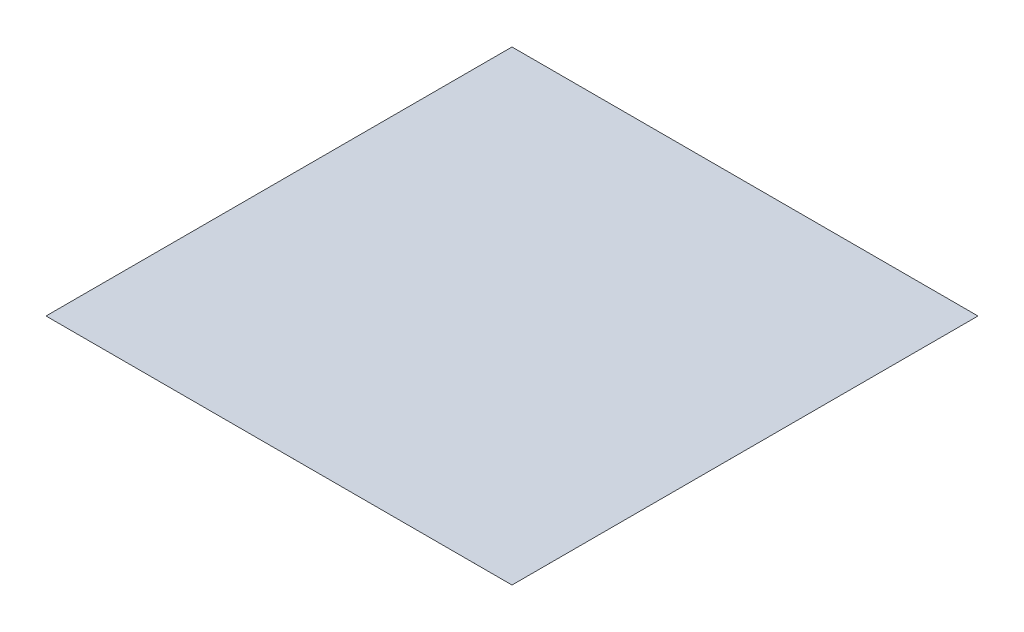
ISO-10303-21;
HEADER;
FILE_DESCRIPTION(('STEP AP214'),'2;1');
FILE_NAME('part.step','',(''),(''),'','','');
FILE_SCHEMA(('AUTOMOTIVE_DESIGN { 1 0 10303 214 1 1 1 1 }'));
ENDSEC;
DATA;
#1=APPLICATION_CONTEXT('core data for automotive mechanical design processes');
#2=APPLICATION_PROTOCOL_DEFINITION('international standard','automotive_design',2000,#1);
#3=PRODUCT_CONTEXT('',#1,'mechanical');
#4=PRODUCT('Part','Part','',(#3));
#5=PRODUCT_RELATED_PRODUCT_CATEGORY('part','',(#4));
#6=PRODUCT_DEFINITION_FORMATION('','',#4);
#7=PRODUCT_DEFINITION_CONTEXT('part definition',#1,'design');
#8=PRODUCT_DEFINITION('design','',#6,#7);
#9=PRODUCT_DEFINITION_SHAPE('','',#8);
#10=(LENGTH_UNIT() NAMED_UNIT(*) SI_UNIT(.MILLI.,.METRE.));
#11=(NAMED_UNIT(*) PLANE_ANGLE_UNIT() SI_UNIT($,.RADIAN.));
#12=(NAMED_UNIT(*) SI_UNIT($,.STERADIAN.) SOLID_ANGLE_UNIT());
#13=UNCERTAINTY_MEASURE_WITH_UNIT(LENGTH_MEASURE(1.E-05),#10,'distance_accuracy_value','');
#14=(GEOMETRIC_REPRESENTATION_CONTEXT(3) GLOBAL_UNCERTAINTY_ASSIGNED_CONTEXT((#13)) GLOBAL_UNIT_ASSIGNED_CONTEXT((#10,
#11,#12)) REPRESENTATION_CONTEXT('',''));
#15=CARTESIAN_POINT('',(0.,0.,0.));
#16=DIRECTION('',(0.,0.,1.));
#17=DIRECTION('',(1.,0.,0.));
#18=AXIS2_PLACEMENT_3D('',#15,#16,#17);
#19=CARTESIAN_POINT('',(325.,0.001,-325.));
#20=DIRECTION('',(-1.,0.,0.));
#21=DIRECTION('',(0.,0.,1.));
#22=AXIS2_PLACEMENT_3D('',#19,#20,#21);
#23=PLANE('',#22);
#24=DIRECTION('',(0.,0.,-1.));
#25=VECTOR('',#24,1.);
#26=CARTESIAN_POINT('',(325.,0.,-325.));
#27=LINE('',#26,#25);
#28=CARTESIAN_POINT('',(325.,0.,325.));
#29=VERTEX_POINT('',#28);
#30=CARTESIAN_POINT('',(325.,0.,-325.));
#31=VERTEX_POINT('',#30);
#32=EDGE_CURVE('E98',#29,#31,#27,.T.);
#33=ORIENTED_EDGE('',*,*,#32,.T.);
#34=DIRECTION('',(0.,-1.,0.));
#35=VECTOR('',#34,1.);
#36=CARTESIAN_POINT('',(325.,0.001,-325.));
#37=LINE('',#36,#35);
#38=CARTESIAN_POINT('',(325.,0.001,-325.));
#39=VERTEX_POINT('',#38);
#40=EDGE_CURVE('E11',#39,#31,#37,.T.);
#41=ORIENTED_EDGE('',*,*,#40,.F.);
#42=DIRECTION('',(0.,0.,-1.));
#43=VECTOR('',#42,1.);
#44=CARTESIAN_POINT('',(325.,0.001,-325.));
#45=LINE('',#44,#43);
#46=CARTESIAN_POINT('',(325.,0.001,325.));
#47=VERTEX_POINT('',#46);
#48=EDGE_CURVE('E86',#47,#39,#45,.T.);
#49=ORIENTED_EDGE('',*,*,#48,.F.);
#50=DIRECTION('',(0.,-1.,0.));
#51=VECTOR('',#50,1.);
#52=CARTESIAN_POINT('',(325.,0.001,325.));
#53=LINE('',#52,#51);
#54=EDGE_CURVE('E94',#47,#29,#53,.T.);
#55=ORIENTED_EDGE('',*,*,#54,.T.);
#56=EDGE_LOOP('',(#33,#41,#49,#55));
#57=FACE_BOUND('',#56,.T.);
#58=ADVANCED_FACE('F35',(#57),#23,.F.);
#59=CARTESIAN_POINT('',(-325.,0.001,-325.));
#60=DIRECTION('',(0.,0.,1.));
#61=DIRECTION('',(1.,0.,0.));
#62=AXIS2_PLACEMENT_3D('',#59,#60,#61);
#63=PLANE('',#62);
#64=DIRECTION('',(-1.,0.,0.));
#65=VECTOR('',#64,1.);
#66=CARTESIAN_POINT('',(-325.,0.,-325.));
#67=LINE('',#66,#65);
#68=CARTESIAN_POINT('',(-325.,0.,-325.));
#69=VERTEX_POINT('',#68);
#70=EDGE_CURVE('E90',#31,#69,#67,.T.);
#71=ORIENTED_EDGE('',*,*,#70,.T.);
#72=DIRECTION('',(0.,-1.,0.));
#73=VECTOR('',#72,1.);
#74=CARTESIAN_POINT('',(-325.,0.001,-325.));
#75=LINE('',#74,#73);
#76=CARTESIAN_POINT('',(-325.,0.001,-325.));
#77=VERTEX_POINT('',#76);
#78=EDGE_CURVE('E43',#77,#69,#75,.T.);
#79=ORIENTED_EDGE('',*,*,#78,.F.);
#80=DIRECTION('',(-1.,0.,0.));
#81=VECTOR('',#80,1.);
#82=CARTESIAN_POINT('',(-325.,0.001,-325.));
#83=LINE('',#82,#81);
#84=EDGE_CURVE('E81',#39,#77,#83,.T.);
#85=ORIENTED_EDGE('',*,*,#84,.F.);
#86=ORIENTED_EDGE('',*,*,#40,.T.);
#87=EDGE_LOOP('',(#71,#79,#85,#86));
#88=FACE_BOUND('',#87,.T.);
#89=ADVANCED_FACE('F89',(#88),#63,.F.);
#90=CARTESIAN_POINT('',(-325.,0.001,-325.));
#91=DIRECTION('',(1.,0.,0.));
#92=DIRECTION('',(0.,0.,-1.));
#93=AXIS2_PLACEMENT_3D('',#90,#91,#92);
#94=PLANE('',#93);
#95=DIRECTION('',(0.,0.,1.));
#96=VECTOR('',#95,1.);
#97=CARTESIAN_POINT('',(-325.,0.,-325.));
#98=LINE('',#97,#96);
#99=CARTESIAN_POINT('',(-325.,0.,325.));
#100=VERTEX_POINT('',#99);
#101=EDGE_CURVE('E68',#69,#100,#98,.T.);
#102=ORIENTED_EDGE('',*,*,#101,.T.);
#103=DIRECTION('',(0.,-1.,0.));
#104=VECTOR('',#103,1.);
#105=CARTESIAN_POINT('',(-325.,0.001,325.));
#106=LINE('',#105,#104);
#107=CARTESIAN_POINT('',(-325.,0.001,325.));
#108=VERTEX_POINT('',#107);
#109=EDGE_CURVE('E91',#108,#100,#106,.T.);
#110=ORIENTED_EDGE('',*,*,#109,.F.);
#111=DIRECTION('',(0.,0.,1.));
#112=VECTOR('',#111,1.);
#113=CARTESIAN_POINT('',(-325.,0.001,-325.));
#114=LINE('',#113,#112);
#115=EDGE_CURVE('E84',#77,#108,#114,.T.);
#116=ORIENTED_EDGE('',*,*,#115,.F.);
#117=ORIENTED_EDGE('',*,*,#78,.T.);
#118=EDGE_LOOP('',(#102,#110,#116,#117));
#119=FACE_BOUND('',#118,.T.);
#120=ADVANCED_FACE('F92',(#119),#94,.F.);
#121=CARTESIAN_POINT('',(-325.,0.001,325.));
#122=DIRECTION('',(0.,0.,-1.));
#123=DIRECTION('',(-1.,0.,0.));
#124=AXIS2_PLACEMENT_3D('',#121,#122,#123);
#125=PLANE('',#124);
#126=DIRECTION('',(1.,0.,0.));
#127=VECTOR('',#126,1.);
#128=CARTESIAN_POINT('',(-325.,0.,325.));
#129=LINE('',#128,#127);
#130=EDGE_CURVE('E74',#100,#29,#129,.T.);
#131=ORIENTED_EDGE('',*,*,#130,.T.);
#132=ORIENTED_EDGE('',*,*,#54,.F.);
#133=DIRECTION('',(1.,0.,0.));
#134=VECTOR('',#133,1.);
#135=CARTESIAN_POINT('',(-325.,0.001,325.));
#136=LINE('',#135,#134);
#137=EDGE_CURVE('E51',#108,#47,#136,.T.);
#138=ORIENTED_EDGE('',*,*,#137,.F.);
#139=ORIENTED_EDGE('',*,*,#109,.T.);
#140=EDGE_LOOP('',(#131,#132,#138,#139));
#141=FACE_BOUND('',#140,.T.);
#142=ADVANCED_FACE('F105',(#141),#125,.F.);
#143=CARTESIAN_POINT('',(0.,0.001,0.));
#144=DIRECTION('',(0.,1.,0.));
#145=DIRECTION('',(0.,0.,1.));
#146=AXIS2_PLACEMENT_3D('',#143,#144,#145);
#147=PLANE('',#146);
#148=ORIENTED_EDGE('',*,*,#48,.T.);
#149=ORIENTED_EDGE('',*,*,#84,.T.);
#150=ORIENTED_EDGE('',*,*,#115,.T.);
#151=ORIENTED_EDGE('',*,*,#137,.T.);
#152=EDGE_LOOP('',(#148,#149,#150,#151));
#153=FACE_BOUND('',#152,.T.);
#154=ADVANCED_FACE('F82',(#153),#147,.T.);
#155=CARTESIAN_POINT('',(0.,0.,0.));
#156=DIRECTION('',(0.,1.,0.));
#157=DIRECTION('',(0.,0.,1.));
#158=AXIS2_PLACEMENT_3D('',#155,#156,#157);
#159=PLANE('',#158);
#160=ORIENTED_EDGE('',*,*,#32,.F.);
#161=ORIENTED_EDGE('',*,*,#130,.F.);
#162=ORIENTED_EDGE('',*,*,#101,.F.);
#163=ORIENTED_EDGE('',*,*,#70,.F.);
#164=EDGE_LOOP('',(#160,#161,#162,#163));
#165=FACE_BOUND('',#164,.T.);
#166=ADVANCED_FACE('F108',(#165),#159,.F.);
#167=CLOSED_SHELL('',(#58,#89,#120,#142,#154,#166));
#168=MANIFOLD_SOLID_BREP('B2',#167);
#169=ADVANCED_BREP_SHAPE_REPRESENTATION('',(#18,#168),#14);
#170=SHAPE_DEFINITION_REPRESENTATION(#9,#169);
ENDSEC;
END-ISO-10303-21;
